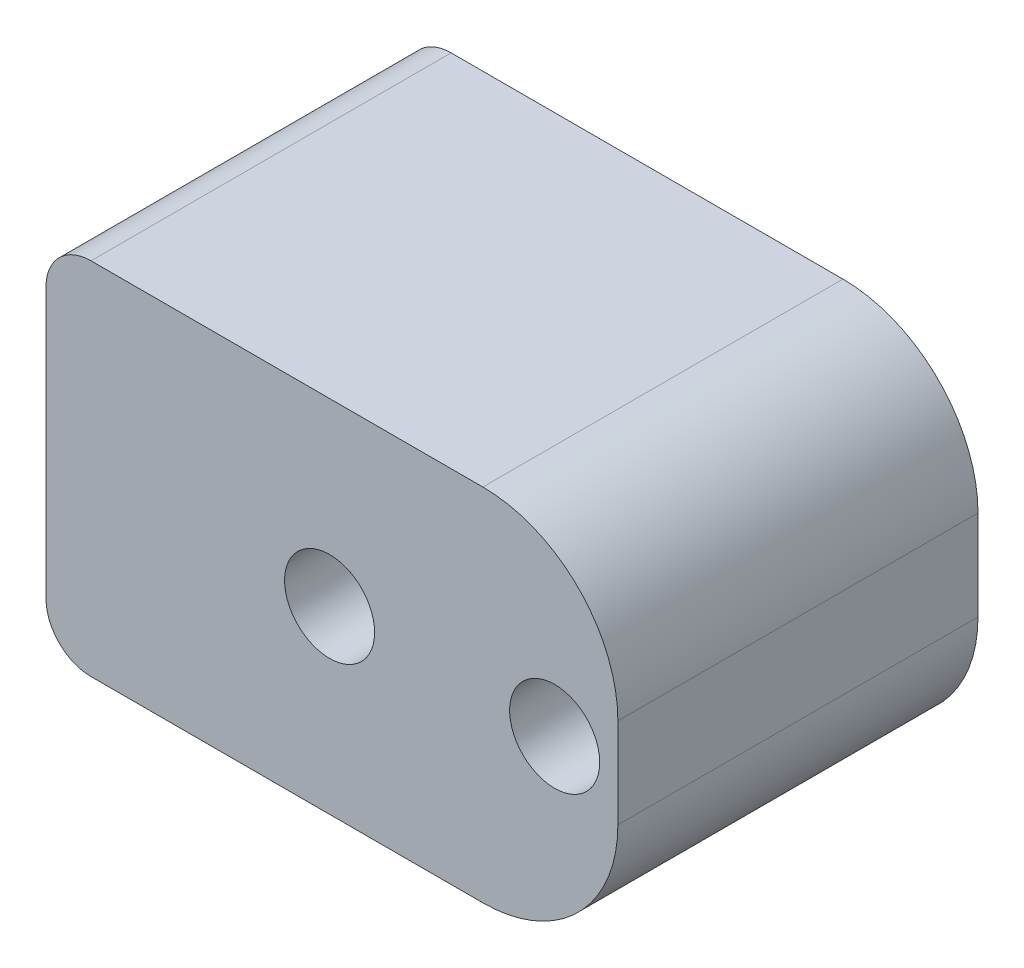
ISO-10303-21;
HEADER;
FILE_DESCRIPTION(('STEP AP214'),'2;1');
FILE_NAME('part.step','',(''),(''),'','','');
FILE_SCHEMA(('AUTOMOTIVE_DESIGN { 1 0 10303 214 1 1 1 1 }'));
ENDSEC;
DATA;
#1=APPLICATION_CONTEXT('core data for automotive mechanical design processes');
#2=APPLICATION_PROTOCOL_DEFINITION('international standard','automotive_design',2000,#1);
#3=PRODUCT_CONTEXT('',#1,'mechanical');
#4=PRODUCT('Part','Part','',(#3));
#5=PRODUCT_RELATED_PRODUCT_CATEGORY('part','',(#4));
#6=PRODUCT_DEFINITION_FORMATION('','',#4);
#7=PRODUCT_DEFINITION_CONTEXT('part definition',#1,'design');
#8=PRODUCT_DEFINITION('design','',#6,#7);
#9=PRODUCT_DEFINITION_SHAPE('','',#8);
#10=(LENGTH_UNIT() NAMED_UNIT(*) SI_UNIT(.MILLI.,.METRE.));
#11=(NAMED_UNIT(*) PLANE_ANGLE_UNIT() SI_UNIT($,.RADIAN.));
#12=(NAMED_UNIT(*) SI_UNIT($,.STERADIAN.) SOLID_ANGLE_UNIT());
#13=UNCERTAINTY_MEASURE_WITH_UNIT(LENGTH_MEASURE(1.E-05),#10,'distance_accuracy_value','');
#14=(GEOMETRIC_REPRESENTATION_CONTEXT(3) GLOBAL_UNCERTAINTY_ASSIGNED_CONTEXT((#13)) GLOBAL_UNIT_ASSIGNED_CONTEXT((#10,
#11,#12)) REPRESENTATION_CONTEXT('',''));
#15=CARTESIAN_POINT('',(0.,0.,0.));
#16=DIRECTION('',(0.,0.,1.));
#17=DIRECTION('',(1.,0.,0.));
#18=AXIS2_PLACEMENT_3D('',#15,#16,#17);
#19=CARTESIAN_POINT('',(0.,-4.,8.));
#20=DIRECTION('',(0.,-1.,0.));
#21=DIRECTION('',(1.,0.,0.));
#22=AXIS2_PLACEMENT_3D('',#19,#20,#21);
#23=PLANE('',#22);
#24=DIRECTION('',(-1.,0.,0.));
#25=VECTOR('',#24,1.);
#26=CARTESIAN_POINT('',(0.,-4.,0.));
#27=LINE('',#26,#25);
#28=CARTESIAN_POINT('',(3.40451268039856,-4.,0.));
#29=VERTEX_POINT('',#28);
#30=CARTESIAN_POINT('',(-5.3,-4.,0.));
#31=VERTEX_POINT('',#30);
#32=EDGE_CURVE('E115',#29,#31,#27,.T.);
#33=ORIENTED_EDGE('',*,*,#32,.F.);
#34=DIRECTION('',(0.,0.,-1.));
#35=VECTOR('',#34,1.);
#36=CARTESIAN_POINT('',(3.40451268039856,-4.,8.));
#37=LINE('',#36,#35);
#38=CARTESIAN_POINT('',(3.40451268039856,-4.,8.));
#39=VERTEX_POINT('',#38);
#40=EDGE_CURVE('E72',#29,#39,#37,.F.);
#41=ORIENTED_EDGE('',*,*,#40,.T.);
#42=DIRECTION('',(-1.,0.,0.));
#43=VECTOR('',#42,1.);
#44=CARTESIAN_POINT('',(0.,-4.,8.));
#45=LINE('',#44,#43);
#46=CARTESIAN_POINT('',(-5.3,-4.,8.));
#47=VERTEX_POINT('',#46);
#48=EDGE_CURVE('E139',#39,#47,#45,.T.);
#49=ORIENTED_EDGE('',*,*,#48,.T.);
#50=DIRECTION('',(0.,0.,-1.));
#51=VECTOR('',#50,1.);
#52=CARTESIAN_POINT('',(-5.3,-4.,0.));
#53=LINE('',#52,#51);
#54=EDGE_CURVE('E133',#47,#31,#53,.T.);
#55=ORIENTED_EDGE('',*,*,#54,.T.);
#56=EDGE_LOOP('',(#33,#41,#49,#55));
#57=FACE_BOUND('',#56,.T.);
#58=ADVANCED_FACE('F48',(#57),#23,.T.);
#59=CARTESIAN_POINT('',(6.40451268039856,0.,8.));
#60=DIRECTION('',(1.,0.,0.));
#61=DIRECTION('',(0.,0.,-1.));
#62=AXIS2_PLACEMENT_3D('',#59,#60,#61);
#63=PLANE('',#62);
#64=DIRECTION('',(0.,-1.,0.));
#65=VECTOR('',#64,1.);
#66=CARTESIAN_POINT('',(6.40451268039856,0.,8.));
#67=LINE('',#66,#65);
#68=CARTESIAN_POINT('',(6.40451268039856,1.,8.));
#69=VERTEX_POINT('',#68);
#70=CARTESIAN_POINT('',(6.40451268039856,-1.,8.));
#71=VERTEX_POINT('',#70);
#72=EDGE_CURVE('E187',#69,#71,#67,.T.);
#73=ORIENTED_EDGE('',*,*,#72,.T.);
#74=DIRECTION('',(0.,0.,-1.));
#75=VECTOR('',#74,1.);
#76=CARTESIAN_POINT('',(6.40451268039856,-1.,8.));
#77=LINE('',#76,#75);
#78=CARTESIAN_POINT('',(6.40451268039856,-1.,0.));
#79=VERTEX_POINT('',#78);
#80=EDGE_CURVE('E171',#71,#79,#77,.T.);
#81=ORIENTED_EDGE('',*,*,#80,.T.);
#82=DIRECTION('',(0.,-1.,0.));
#83=VECTOR('',#82,1.);
#84=CARTESIAN_POINT('',(6.40451268039856,0.,0.));
#85=LINE('',#84,#83);
#86=CARTESIAN_POINT('',(6.40451268039856,1.,0.));
#87=VERTEX_POINT('',#86);
#88=EDGE_CURVE('E125',#87,#79,#85,.T.);
#89=ORIENTED_EDGE('',*,*,#88,.F.);
#90=DIRECTION('',(0.,0.,-1.));
#91=VECTOR('',#90,1.);
#92=CARTESIAN_POINT('',(6.40451268039856,1.,8.));
#93=LINE('',#92,#91);
#94=EDGE_CURVE('E168',#87,#69,#93,.F.);
#95=ORIENTED_EDGE('',*,*,#94,.T.);
#96=EDGE_LOOP('',(#73,#81,#89,#95));
#97=FACE_BOUND('',#96,.T.);
#98=ADVANCED_FACE('F191',(#97),#63,.T.);
#99=CARTESIAN_POINT('',(0.,4.,8.));
#100=DIRECTION('',(0.,1.,0.));
#101=DIRECTION('',(-1.,0.,0.));
#102=AXIS2_PLACEMENT_3D('',#99,#100,#101);
#103=PLANE('',#102);
#104=DIRECTION('',(1.,0.,0.));
#105=VECTOR('',#104,1.);
#106=CARTESIAN_POINT('',(0.,4.,8.));
#107=LINE('',#106,#105);
#108=CARTESIAN_POINT('',(-5.3,4.,8.));
#109=VERTEX_POINT('',#108);
#110=CARTESIAN_POINT('',(3.40451268039856,4.,8.));
#111=VERTEX_POINT('',#110);
#112=EDGE_CURVE('E148',#109,#111,#107,.T.);
#113=ORIENTED_EDGE('',*,*,#112,.T.);
#114=DIRECTION('',(0.,0.,-1.));
#115=VECTOR('',#114,1.);
#116=CARTESIAN_POINT('',(3.40451268039856,4.,8.));
#117=LINE('',#116,#115);
#118=CARTESIAN_POINT('',(3.40451268039856,4.,0.));
#119=VERTEX_POINT('',#118);
#120=EDGE_CURVE('E11',#111,#119,#117,.T.);
#121=ORIENTED_EDGE('',*,*,#120,.T.);
#122=DIRECTION('',(1.,0.,0.));
#123=VECTOR('',#122,1.);
#124=CARTESIAN_POINT('',(0.,4.,0.));
#125=LINE('',#124,#123);
#126=CARTESIAN_POINT('',(-5.3,4.,0.));
#127=VERTEX_POINT('',#126);
#128=EDGE_CURVE('E252',#127,#119,#125,.T.);
#129=ORIENTED_EDGE('',*,*,#128,.F.);
#130=DIRECTION('',(0.,0.,-1.));
#131=VECTOR('',#130,1.);
#132=CARTESIAN_POINT('',(-5.3,4.,8.));
#133=LINE('',#132,#131);
#134=EDGE_CURVE('E165',#127,#109,#133,.F.);
#135=ORIENTED_EDGE('',*,*,#134,.T.);
#136=EDGE_LOOP('',(#113,#121,#129,#135));
#137=FACE_BOUND('',#136,.T.);
#138=ADVANCED_FACE('F212',(#137),#103,.T.);
#139=CARTESIAN_POINT('',(0.,0.,8.));
#140=DIRECTION('',(0.,0.,-1.));
#141=DIRECTION('',(-1.,0.,0.));
#142=AXIS2_PLACEMENT_3D('',#139,#140,#141);
#143=CYLINDRICAL_SURFACE('',#142,1.);
#144=CARTESIAN_POINT('',(0.,0.,8.));
#145=DIRECTION('',(0.,0.,1.));
#146=DIRECTION('',(1.,0.,0.));
#147=AXIS2_PLACEMENT_3D('',#144,#145,#146);
#148=CIRCLE('',#147,1.);
#149=CARTESIAN_POINT('',(1.,0.,8.));
#150=VERTEX_POINT('',#149);
#151=EDGE_CURVE('E266',#150,#150,#148,.T.);
#152=ORIENTED_EDGE('',*,*,#151,.T.);
#153=EDGE_LOOP('',(#152));
#154=FACE_BOUND('',#153,.T.);
#155=CARTESIAN_POINT('',(0.,0.,0.));
#156=DIRECTION('',(0.,0.,1.));
#157=DIRECTION('',(1.,0.,0.));
#158=AXIS2_PLACEMENT_3D('',#155,#156,#157);
#159=CIRCLE('',#158,1.);
#160=CARTESIAN_POINT('',(1.,0.,0.));
#161=VERTEX_POINT('',#160);
#162=EDGE_CURVE('E126',#161,#161,#159,.T.);
#163=ORIENTED_EDGE('',*,*,#162,.F.);
#164=EDGE_LOOP('',(#163));
#165=FACE_BOUND('',#164,.T.);
#166=ADVANCED_FACE('F216',(#154,#165),#143,.F.);
#167=CARTESIAN_POINT('',(5.,0.,8.));
#168=DIRECTION('',(0.,0.,-1.));
#169=DIRECTION('',(-1.,0.,0.));
#170=AXIS2_PLACEMENT_3D('',#167,#168,#169);
#171=CYLINDRICAL_SURFACE('',#170,1.);
#172=CARTESIAN_POINT('',(5.,0.,8.));
#173=DIRECTION('',(0.,0.,1.));
#174=DIRECTION('',(1.,0.,0.));
#175=AXIS2_PLACEMENT_3D('',#172,#173,#174);
#176=CIRCLE('',#175,1.);
#177=CARTESIAN_POINT('',(6.,0.,8.));
#178=VERTEX_POINT('',#177);
#179=EDGE_CURVE('E270',#178,#178,#176,.T.);
#180=ORIENTED_EDGE('',*,*,#179,.T.);
#181=EDGE_LOOP('',(#180));
#182=FACE_BOUND('',#181,.T.);
#183=CARTESIAN_POINT('',(5.,0.,0.));
#184=DIRECTION('',(0.,0.,1.));
#185=DIRECTION('',(1.,0.,0.));
#186=AXIS2_PLACEMENT_3D('',#183,#184,#185);
#187=CIRCLE('',#186,1.);
#188=CARTESIAN_POINT('',(6.,0.,0.));
#189=VERTEX_POINT('',#188);
#190=EDGE_CURVE('E260',#189,#189,#187,.T.);
#191=ORIENTED_EDGE('',*,*,#190,.F.);
#192=EDGE_LOOP('',(#191));
#193=FACE_BOUND('',#192,.T.);
#194=ADVANCED_FACE('F219',(#182,#193),#171,.F.);
#195=CARTESIAN_POINT('',(-6.3,0.,8.));
#196=DIRECTION('',(1.,0.,0.));
#197=DIRECTION('',(0.,0.,-1.));
#198=AXIS2_PLACEMENT_3D('',#195,#196,#197);
#199=PLANE('',#198);
#200=DIRECTION('',(0.,-1.,0.));
#201=VECTOR('',#200,1.);
#202=CARTESIAN_POINT('',(-6.3,0.,0.));
#203=LINE('',#202,#201);
#204=CARTESIAN_POINT('',(-6.3,3.,0.));
#205=VERTEX_POINT('',#204);
#206=CARTESIAN_POINT('',(-6.3,-3.,0.));
#207=VERTEX_POINT('',#206);
#208=EDGE_CURVE('E151',#205,#207,#203,.T.);
#209=ORIENTED_EDGE('',*,*,#208,.T.);
#210=DIRECTION('',(0.,0.,-1.));
#211=VECTOR('',#210,1.);
#212=CARTESIAN_POINT('',(-6.3,-3.,8.));
#213=LINE('',#212,#211);
#214=CARTESIAN_POINT('',(-6.3,-3.,8.));
#215=VERTEX_POINT('',#214);
#216=EDGE_CURVE('E134',#207,#215,#213,.F.);
#217=ORIENTED_EDGE('',*,*,#216,.T.);
#218=DIRECTION('',(0.,-1.,0.));
#219=VECTOR('',#218,1.);
#220=CARTESIAN_POINT('',(-6.3,0.,8.));
#221=LINE('',#220,#219);
#222=CARTESIAN_POINT('',(-6.3,3.,8.));
#223=VERTEX_POINT('',#222);
#224=EDGE_CURVE('E142',#223,#215,#221,.T.);
#225=ORIENTED_EDGE('',*,*,#224,.F.);
#226=DIRECTION('',(0.,0.,-1.));
#227=VECTOR('',#226,1.);
#228=CARTESIAN_POINT('',(-6.3,3.,0.));
#229=LINE('',#228,#227);
#230=EDGE_CURVE('E136',#223,#205,#229,.T.);
#231=ORIENTED_EDGE('',*,*,#230,.T.);
#232=EDGE_LOOP('',(#209,#217,#225,#231));
#233=FACE_BOUND('',#232,.T.);
#234=ADVANCED_FACE('F223',(#233),#199,.F.);
#235=CARTESIAN_POINT('',(0.,0.,8.));
#236=DIRECTION('',(0.,0.,1.));
#237=DIRECTION('',(1.,0.,0.));
#238=AXIS2_PLACEMENT_3D('',#235,#236,#237);
#239=PLANE('',#238);
#240=ORIENTED_EDGE('',*,*,#179,.F.);
#241=EDGE_LOOP('',(#240));
#242=FACE_BOUND('',#241,.T.);
#243=ORIENTED_EDGE('',*,*,#151,.F.);
#244=EDGE_LOOP('',(#243));
#245=FACE_BOUND('',#244,.T.);
#246=ORIENTED_EDGE('',*,*,#48,.F.);
#247=CARTESIAN_POINT('',(3.40451268039856,-1.,8.));
#248=DIRECTION('',(0.,0.,1.));
#249=DIRECTION('',(1.,0.,0.));
#250=AXIS2_PLACEMENT_3D('',#247,#248,#249);
#251=CIRCLE('',#250,3.);
#252=EDGE_CURVE('E57',#39,#71,#251,.T.);
#253=ORIENTED_EDGE('',*,*,#252,.T.);
#254=ORIENTED_EDGE('',*,*,#72,.F.);
#255=CARTESIAN_POINT('',(3.40451268039856,1.,8.));
#256=DIRECTION('',(0.,0.,1.));
#257=DIRECTION('',(1.,0.,0.));
#258=AXIS2_PLACEMENT_3D('',#255,#256,#257);
#259=CIRCLE('',#258,3.);
#260=EDGE_CURVE('E64',#69,#111,#259,.T.);
#261=ORIENTED_EDGE('',*,*,#260,.T.);
#262=ORIENTED_EDGE('',*,*,#112,.F.);
#263=CARTESIAN_POINT('',(-5.3,3.,8.));
#264=DIRECTION('',(0.,0.,1.));
#265=DIRECTION('',(1.,0.,0.));
#266=AXIS2_PLACEMENT_3D('',#263,#264,#265);
#267=CIRCLE('',#266,1.);
#268=EDGE_CURVE('E159',#109,#223,#267,.T.);
#269=ORIENTED_EDGE('',*,*,#268,.T.);
#270=ORIENTED_EDGE('',*,*,#224,.T.);
#271=CARTESIAN_POINT('',(-5.3,-3.,8.));
#272=DIRECTION('',(0.,0.,1.));
#273=DIRECTION('',(1.,0.,0.));
#274=AXIS2_PLACEMENT_3D('',#271,#272,#273);
#275=CIRCLE('',#274,1.);
#276=EDGE_CURVE('E162',#215,#47,#275,.T.);
#277=ORIENTED_EDGE('',*,*,#276,.T.);
#278=EDGE_LOOP('',(#246,#253,#254,#261,#262,#269,#270,#277));
#279=FACE_BOUND('',#278,.T.);
#280=ADVANCED_FACE('F186',(#242,#245,#279),#239,.T.);
#281=CARTESIAN_POINT('',(0.,0.,0.));
#282=DIRECTION('',(0.,0.,1.));
#283=DIRECTION('',(1.,0.,0.));
#284=AXIS2_PLACEMENT_3D('',#281,#282,#283);
#285=PLANE('',#284);
#286=ORIENTED_EDGE('',*,*,#190,.T.);
#287=EDGE_LOOP('',(#286));
#288=FACE_BOUND('',#287,.T.);
#289=ORIENTED_EDGE('',*,*,#162,.T.);
#290=EDGE_LOOP('',(#289));
#291=FACE_BOUND('',#290,.T.);
#292=ORIENTED_EDGE('',*,*,#88,.T.);
#293=CARTESIAN_POINT('',(3.40451268039856,-1.,0.));
#294=DIRECTION('',(0.,0.,1.));
#295=DIRECTION('',(1.,0.,0.));
#296=AXIS2_PLACEMENT_3D('',#293,#294,#295);
#297=CIRCLE('',#296,3.);
#298=EDGE_CURVE('E122',#79,#29,#297,.F.);
#299=ORIENTED_EDGE('',*,*,#298,.T.);
#300=ORIENTED_EDGE('',*,*,#32,.T.);
#301=CARTESIAN_POINT('',(-5.3,-3.,0.));
#302=DIRECTION('',(0.,0.,1.));
#303=DIRECTION('',(1.,0.,0.));
#304=AXIS2_PLACEMENT_3D('',#301,#302,#303);
#305=CIRCLE('',#304,1.);
#306=EDGE_CURVE('E120',#31,#207,#305,.F.);
#307=ORIENTED_EDGE('',*,*,#306,.T.);
#308=ORIENTED_EDGE('',*,*,#208,.F.);
#309=CARTESIAN_POINT('',(-5.3,3.,0.));
#310=DIRECTION('',(0.,0.,1.));
#311=DIRECTION('',(1.,0.,0.));
#312=AXIS2_PLACEMENT_3D('',#309,#310,#311);
#313=CIRCLE('',#312,1.);
#314=EDGE_CURVE('E137',#205,#127,#313,.F.);
#315=ORIENTED_EDGE('',*,*,#314,.T.);
#316=ORIENTED_EDGE('',*,*,#128,.T.);
#317=CARTESIAN_POINT('',(3.40451268039856,1.,0.));
#318=DIRECTION('',(0.,0.,1.));
#319=DIRECTION('',(1.,0.,0.));
#320=AXIS2_PLACEMENT_3D('',#317,#318,#319);
#321=CIRCLE('',#320,3.);
#322=EDGE_CURVE('E175',#119,#87,#321,.F.);
#323=ORIENTED_EDGE('',*,*,#322,.T.);
#324=EDGE_LOOP('',(#292,#299,#300,#307,#308,#315,#316,#323));
#325=FACE_BOUND('',#324,.T.);
#326=ADVANCED_FACE('F118',(#288,#291,#325),#285,.F.);
#327=CARTESIAN_POINT('',(-5.3,-3.,8.));
#328=DIRECTION('',(0.,0.,1.));
#329=DIRECTION('',(1.,0.,0.));
#330=AXIS2_PLACEMENT_3D('',#327,#328,#329);
#331=CYLINDRICAL_SURFACE('',#330,1.);
#332=ORIENTED_EDGE('',*,*,#276,.F.);
#333=ORIENTED_EDGE('',*,*,#216,.F.);
#334=ORIENTED_EDGE('',*,*,#306,.F.);
#335=ORIENTED_EDGE('',*,*,#54,.F.);
#336=EDGE_LOOP('',(#332,#333,#334,#335));
#337=FACE_BOUND('',#336,.T.);
#338=ADVANCED_FACE('F132',(#337),#331,.T.);
#339=CARTESIAN_POINT('',(-5.3,3.,8.));
#340=DIRECTION('',(0.,0.,1.));
#341=DIRECTION('',(1.,0.,0.));
#342=AXIS2_PLACEMENT_3D('',#339,#340,#341);
#343=CYLINDRICAL_SURFACE('',#342,1.);
#344=ORIENTED_EDGE('',*,*,#268,.F.);
#345=ORIENTED_EDGE('',*,*,#134,.F.);
#346=ORIENTED_EDGE('',*,*,#314,.F.);
#347=ORIENTED_EDGE('',*,*,#230,.F.);
#348=EDGE_LOOP('',(#344,#345,#346,#347));
#349=FACE_BOUND('',#348,.T.);
#350=ADVANCED_FACE('F198',(#349),#343,.T.);
#351=CARTESIAN_POINT('',(3.40451268039856,-1.,8.));
#352=DIRECTION('',(0.,0.,-1.));
#353=DIRECTION('',(-1.,0.,0.));
#354=AXIS2_PLACEMENT_3D('',#351,#352,#353);
#355=CYLINDRICAL_SURFACE('',#354,3.);
#356=ORIENTED_EDGE('',*,*,#252,.F.);
#357=ORIENTED_EDGE('',*,*,#40,.F.);
#358=ORIENTED_EDGE('',*,*,#298,.F.);
#359=ORIENTED_EDGE('',*,*,#80,.F.);
#360=EDGE_LOOP('',(#356,#357,#358,#359));
#361=FACE_BOUND('',#360,.T.);
#362=ADVANCED_FACE('F196',(#361),#355,.T.);
#363=CARTESIAN_POINT('',(3.40451268039856,1.,8.));
#364=DIRECTION('',(0.,0.,-1.));
#365=DIRECTION('',(-1.,0.,0.));
#366=AXIS2_PLACEMENT_3D('',#363,#364,#365);
#367=CYLINDRICAL_SURFACE('',#366,3.);
#368=ORIENTED_EDGE('',*,*,#260,.F.);
#369=ORIENTED_EDGE('',*,*,#94,.F.);
#370=ORIENTED_EDGE('',*,*,#322,.F.);
#371=ORIENTED_EDGE('',*,*,#120,.F.);
#372=EDGE_LOOP('',(#368,#369,#370,#371));
#373=FACE_BOUND('',#372,.T.);
#374=ADVANCED_FACE('F50',(#373),#367,.T.);
#375=CLOSED_SHELL('',(#58,#98,#138,#166,#194,#234,#280,#326,#338,#350,#362,#374));
#376=CARTESIAN_POINT('',(-2.8,0.,4.));
#377=DIRECTION('',(-1.,0.,0.));
#378=DIRECTION('',(0.,0.,1.));
#379=AXIS2_PLACEMENT_3D('',#376,#377,#378);
#380=CYLINDRICAL_SURFACE('',#379,3.25);
#381=CARTESIAN_POINT('',(-2.8,0.,4.));
#382=DIRECTION('',(-1.,0.,0.));
#383=DIRECTION('',(0.,0.,1.));
#384=AXIS2_PLACEMENT_3D('',#381,#382,#383);
#385=CIRCLE('',#384,3.25);
#386=CARTESIAN_POINT('',(-2.8,0.,7.25));
#387=VERTEX_POINT('',#386);
#388=EDGE_CURVE('E262',#387,#387,#385,.T.);
#389=CARTESIAN_POINT('',(-5.5,0.,4.));
#390=DIRECTION('',(-1.,0.,0.));
#391=DIRECTION('',(0.,0.,1.));
#392=AXIS2_PLACEMENT_3D('',#389,#390,#391);
#393=CIRCLE('',#392,3.25);
#394=CARTESIAN_POINT('',(-5.5,0.,7.25));
#395=VERTEX_POINT('',#394);
#396=EDGE_CURVE('E274',#395,#395,#393,.T.);
#397=CARTESIAN_POINT('',(-2.8,0.,7.25));
#398=CARTESIAN_POINT('',(-2.828125,0.,7.25));
#399=CARTESIAN_POINT('',(-2.85625,0.,7.25));
#400=CARTESIAN_POINT('',(-2.9125,0.,7.25));
#401=CARTESIAN_POINT('',(-2.940625,0.,7.25));
#402=CARTESIAN_POINT('',(-2.996875,0.,7.25));
#403=CARTESIAN_POINT('',(-3.025,0.,7.25));
#404=CARTESIAN_POINT('',(-3.08125,0.,7.25));
#405=CARTESIAN_POINT('',(-3.109375,0.,7.25));
#406=CARTESIAN_POINT('',(-3.165625,0.,7.25));
#407=CARTESIAN_POINT('',(-3.19375,0.,7.25));
#408=CARTESIAN_POINT('',(-3.25,0.,7.25));
#409=CARTESIAN_POINT('',(-3.278125,0.,7.25));
#410=CARTESIAN_POINT('',(-3.334375,0.,7.25));
#411=CARTESIAN_POINT('',(-3.3625,0.,7.25));
#412=CARTESIAN_POINT('',(-3.41875,0.,7.25));
#413=CARTESIAN_POINT('',(-3.446875,0.,7.25));
#414=CARTESIAN_POINT('',(-3.503125,0.,7.25));
#415=CARTESIAN_POINT('',(-3.53125,0.,7.25));
#416=CARTESIAN_POINT('',(-3.5875,0.,7.25));
#417=CARTESIAN_POINT('',(-3.615625,0.,7.25));
#418=CARTESIAN_POINT('',(-3.671875,0.,7.25));
#419=CARTESIAN_POINT('',(-3.7,0.,7.25));
#420=CARTESIAN_POINT('',(-3.75625,0.,7.25));
#421=CARTESIAN_POINT('',(-3.784375,0.,7.25));
#422=CARTESIAN_POINT('',(-3.840625,0.,7.25));
#423=CARTESIAN_POINT('',(-3.86875,0.,7.25));
#424=CARTESIAN_POINT('',(-3.925,0.,7.25));
#425=CARTESIAN_POINT('',(-3.953125,0.,7.25));
#426=CARTESIAN_POINT('',(-4.009375,0.,7.25));
#427=CARTESIAN_POINT('',(-4.0375,0.,7.25));
#428=CARTESIAN_POINT('',(-4.09375,0.,7.25));
#429=CARTESIAN_POINT('',(-4.121875,0.,7.25));
#430=CARTESIAN_POINT('',(-4.178125,0.,7.25));
#431=CARTESIAN_POINT('',(-4.20625,0.,7.25));
#432=CARTESIAN_POINT('',(-4.2625,0.,7.25));
#433=CARTESIAN_POINT('',(-4.290625,0.,7.25));
#434=CARTESIAN_POINT('',(-4.346875,0.,7.25));
#435=CARTESIAN_POINT('',(-4.375,0.,7.25));
#436=CARTESIAN_POINT('',(-4.43125,0.,7.25));
#437=CARTESIAN_POINT('',(-4.459375,0.,7.25));
#438=CARTESIAN_POINT('',(-4.515625,0.,7.25));
#439=CARTESIAN_POINT('',(-4.54375,0.,7.25));
#440=CARTESIAN_POINT('',(-4.6,0.,7.25));
#441=CARTESIAN_POINT('',(-4.628125,0.,7.25));
#442=CARTESIAN_POINT('',(-4.684375,0.,7.25));
#443=CARTESIAN_POINT('',(-4.7125,0.,7.25));
#444=CARTESIAN_POINT('',(-4.76875,0.,7.25));
#445=CARTESIAN_POINT('',(-4.796875,0.,7.25));
#446=CARTESIAN_POINT('',(-4.853125,0.,7.25));
#447=CARTESIAN_POINT('',(-4.88125,0.,7.25));
#448=CARTESIAN_POINT('',(-4.9375,0.,7.25));
#449=CARTESIAN_POINT('',(-4.965625,0.,7.25));
#450=CARTESIAN_POINT('',(-5.021875,0.,7.25));
#451=CARTESIAN_POINT('',(-5.05,0.,7.25));
#452=CARTESIAN_POINT('',(-5.10625,0.,7.25));
#453=CARTESIAN_POINT('',(-5.134375,0.,7.25));
#454=CARTESIAN_POINT('',(-5.190625,0.,7.25));
#455=CARTESIAN_POINT('',(-5.21875,0.,7.25));
#456=CARTESIAN_POINT('',(-5.275,0.,7.25));
#457=CARTESIAN_POINT('',(-5.303125,0.,7.25));
#458=CARTESIAN_POINT('',(-5.359375,0.,7.25));
#459=CARTESIAN_POINT('',(-5.3875,0.,7.25));
#460=CARTESIAN_POINT('',(-5.44375,0.,7.25));
#461=CARTESIAN_POINT('',(-5.471875,0.,7.25));
#462=CARTESIAN_POINT('',(-5.5,0.,7.25));
#463=B_SPLINE_CURVE_WITH_KNOTS('',3,(#397,#398,#399,#400,#401,#402,#403,#404,#405,#406,#407,
#408,#409,#410,#411,#412,#413,#414,#415,#416,#417,#418,#419,#420,#421,#422,#423,#424,#425,#426,
#427,#428,#429,#430,#431,#432,#433,#434,#435,#436,#437,#438,#439,#440,#441,#442,#443,#444,#445,
#446,#447,#448,#449,#450,#451,#452,#453,#454,#455,#456,#457,#458,#459,#460,#461,#462),
.UNSPECIFIED.,.F.,.F.,(4,2,2,2,2,2,2,2,2,2,2,2,2,2,2,2,2,2,2,2,2,2,2,2,2,2,2,2,2,2,2,2,4),(0.,
0.0843750000000003,0.16875,0.253125,0.3375,0.421875,0.50625,0.590625,0.675,0.759375,0.84375,
0.928125000000001,1.0125,1.096875,1.18125,1.265625,1.35,1.434375,1.51875,1.603125,1.6875,
1.771875,1.85625,1.940625,2.025,2.109375,2.19375,2.278125,2.3625,2.446875,2.53125,2.615625,2.7),.UNSPECIFIED.);
#464=EDGE_CURVE('BSEAM284',#387,#395,#463,.T.);
#465=ORIENTED_EDGE('',*,*,#388,.F.);
#466=ORIENTED_EDGE('',*,*,#396,.T.);
#467=ORIENTED_EDGE('',*,*,#464,.T.);
#468=ORIENTED_EDGE('',*,*,#464,.F.);
#469=EDGE_LOOP('',(#465,#467,#466,#468));
#470=FACE_BOUND('',#469,.T.);
#471=ADVANCED_FACE('F284',(#470),#380,.F.);
#472=CARTESIAN_POINT('',(-2.8,0.,4.));
#473=DIRECTION('',(-1.,0.,0.));
#474=DIRECTION('',(0.,0.,1.));
#475=AXIS2_PLACEMENT_3D('',#472,#473,#474);
#476=PLANE('',#475);
#477=ORIENTED_EDGE('',*,*,#388,.T.);
#478=EDGE_LOOP('',(#477));
#479=FACE_BOUND('',#478,.T.);
#480=ADVANCED_FACE('F282',(#479),#476,.T.);
#481=CARTESIAN_POINT('',(-5.5,0.,4.));
#482=DIRECTION('',(-1.,0.,0.));
#483=DIRECTION('',(0.,0.,1.));
#484=AXIS2_PLACEMENT_3D('',#481,#482,#483);
#485=PLANE('',#484);
#486=ORIENTED_EDGE('',*,*,#396,.F.);
#487=EDGE_LOOP('',(#486));
#488=FACE_BOUND('',#487,.T.);
#489=ADVANCED_FACE('F290',(#488),#485,.F.);
#490=CLOSED_SHELL('',(#471,#480,#489));
#491=ORIENTED_CLOSED_SHELL('',*,#490,.T.);
#492=BREP_WITH_VOIDS('B2',#375,(#491));
#493=ADVANCED_BREP_SHAPE_REPRESENTATION('',(#18,#492),#14);
#494=SHAPE_DEFINITION_REPRESENTATION(#9,#493);
ENDSEC;
END-ISO-10303-21;
